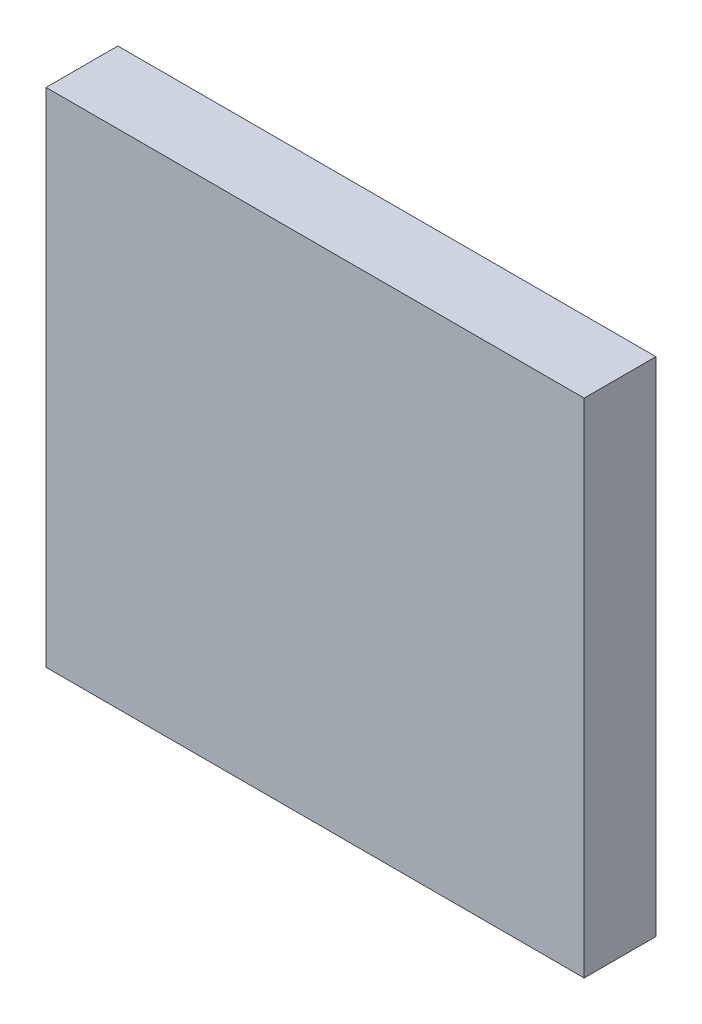
ISO-10303-21;
HEADER;
FILE_DESCRIPTION(('STEP AP214'),'2;1');
FILE_NAME('part.step','',(''),(''),'','','');
FILE_SCHEMA(('AUTOMOTIVE_DESIGN { 1 0 10303 214 1 1 1 1 }'));
ENDSEC;
DATA;
#1=APPLICATION_CONTEXT('core data for automotive mechanical design processes');
#2=APPLICATION_PROTOCOL_DEFINITION('international standard','automotive_design',2000,#1);
#3=PRODUCT_CONTEXT('',#1,'mechanical');
#4=PRODUCT('Part','Part','',(#3));
#5=PRODUCT_RELATED_PRODUCT_CATEGORY('part','',(#4));
#6=PRODUCT_DEFINITION_FORMATION('','',#4);
#7=PRODUCT_DEFINITION_CONTEXT('part definition',#1,'design');
#8=PRODUCT_DEFINITION('design','',#6,#7);
#9=PRODUCT_DEFINITION_SHAPE('','',#8);
#10=(LENGTH_UNIT() NAMED_UNIT(*) SI_UNIT(.MILLI.,.METRE.));
#11=(NAMED_UNIT(*) PLANE_ANGLE_UNIT() SI_UNIT($,.RADIAN.));
#12=(NAMED_UNIT(*) SI_UNIT($,.STERADIAN.) SOLID_ANGLE_UNIT());
#13=UNCERTAINTY_MEASURE_WITH_UNIT(LENGTH_MEASURE(1.E-05),#10,'distance_accuracy_value','');
#14=(GEOMETRIC_REPRESENTATION_CONTEXT(3) GLOBAL_UNCERTAINTY_ASSIGNED_CONTEXT((#13)) GLOBAL_UNIT_ASSIGNED_CONTEXT((#10,
#11,#12)) REPRESENTATION_CONTEXT('',''));
#15=CARTESIAN_POINT('',(0.,0.,0.));
#16=DIRECTION('',(0.,0.,1.));
#17=DIRECTION('',(1.,0.,0.));
#18=AXIS2_PLACEMENT_3D('',#15,#16,#17);
#19=CARTESIAN_POINT('',(75.,-70.,20.));
#20=DIRECTION('',(-1.,0.,0.));
#21=DIRECTION('',(0.,0.,1.));
#22=AXIS2_PLACEMENT_3D('',#19,#20,#21);
#23=PLANE('',#22);
#24=DIRECTION('',(0.,1.,0.));
#25=VECTOR('',#24,1.);
#26=CARTESIAN_POINT('',(75.,-70.,0.));
#27=LINE('',#26,#25);
#28=CARTESIAN_POINT('',(75.,-70.,0.));
#29=VERTEX_POINT('',#28);
#30=CARTESIAN_POINT('',(75.,70.,0.));
#31=VERTEX_POINT('',#30);
#32=EDGE_CURVE('E95',#29,#31,#27,.T.);
#33=ORIENTED_EDGE('',*,*,#32,.T.);
#34=DIRECTION('',(0.,0.,-1.));
#35=VECTOR('',#34,1.);
#36=CARTESIAN_POINT('',(75.,70.,20.));
#37=LINE('',#36,#35);
#38=CARTESIAN_POINT('',(75.,70.,20.));
#39=VERTEX_POINT('',#38);
#40=EDGE_CURVE('E11',#39,#31,#37,.T.);
#41=ORIENTED_EDGE('',*,*,#40,.F.);
#42=DIRECTION('',(0.,1.,0.));
#43=VECTOR('',#42,1.);
#44=CARTESIAN_POINT('',(75.,-70.,20.));
#45=LINE('',#44,#43);
#46=CARTESIAN_POINT('',(75.,-70.,20.));
#47=VERTEX_POINT('',#46);
#48=EDGE_CURVE('E83',#47,#39,#45,.T.);
#49=ORIENTED_EDGE('',*,*,#48,.F.);
#50=DIRECTION('',(0.,0.,-1.));
#51=VECTOR('',#50,1.);
#52=CARTESIAN_POINT('',(75.,-70.,20.));
#53=LINE('',#52,#51);
#54=EDGE_CURVE('E91',#47,#29,#53,.T.);
#55=ORIENTED_EDGE('',*,*,#54,.T.);
#56=EDGE_LOOP('',(#33,#41,#49,#55));
#57=FACE_BOUND('',#56,.T.);
#58=ADVANCED_FACE('F32',(#57),#23,.F.);
#59=CARTESIAN_POINT('',(-75.,70.,20.));
#60=DIRECTION('',(0.,-1.,0.));
#61=DIRECTION('',(0.,0.,-1.));
#62=AXIS2_PLACEMENT_3D('',#59,#60,#61);
#63=PLANE('',#62);
#64=DIRECTION('',(-1.,0.,0.));
#65=VECTOR('',#64,1.);
#66=CARTESIAN_POINT('',(-75.,70.,0.));
#67=LINE('',#66,#65);
#68=CARTESIAN_POINT('',(-75.,70.,0.));
#69=VERTEX_POINT('',#68);
#70=EDGE_CURVE('E87',#31,#69,#67,.T.);
#71=ORIENTED_EDGE('',*,*,#70,.T.);
#72=DIRECTION('',(0.,0.,-1.));
#73=VECTOR('',#72,1.);
#74=CARTESIAN_POINT('',(-75.,70.,20.));
#75=LINE('',#74,#73);
#76=CARTESIAN_POINT('',(-75.,70.,20.));
#77=VERTEX_POINT('',#76);
#78=EDGE_CURVE('E40',#77,#69,#75,.T.);
#79=ORIENTED_EDGE('',*,*,#78,.F.);
#80=DIRECTION('',(-1.,0.,0.));
#81=VECTOR('',#80,1.);
#82=CARTESIAN_POINT('',(-75.,70.,20.));
#83=LINE('',#82,#81);
#84=EDGE_CURVE('E78',#39,#77,#83,.T.);
#85=ORIENTED_EDGE('',*,*,#84,.F.);
#86=ORIENTED_EDGE('',*,*,#40,.T.);
#87=EDGE_LOOP('',(#71,#79,#85,#86));
#88=FACE_BOUND('',#87,.T.);
#89=ADVANCED_FACE('F86',(#88),#63,.F.);
#90=CARTESIAN_POINT('',(-75.,-70.,20.));
#91=DIRECTION('',(1.,0.,0.));
#92=DIRECTION('',(0.,0.,-1.));
#93=AXIS2_PLACEMENT_3D('',#90,#91,#92);
#94=PLANE('',#93);
#95=DIRECTION('',(0.,-1.,0.));
#96=VECTOR('',#95,1.);
#97=CARTESIAN_POINT('',(-75.,-70.,0.));
#98=LINE('',#97,#96);
#99=CARTESIAN_POINT('',(-75.,-70.,0.));
#100=VERTEX_POINT('',#99);
#101=EDGE_CURVE('E65',#69,#100,#98,.T.);
#102=ORIENTED_EDGE('',*,*,#101,.T.);
#103=DIRECTION('',(0.,0.,-1.));
#104=VECTOR('',#103,1.);
#105=CARTESIAN_POINT('',(-75.,-70.,20.));
#106=LINE('',#105,#104);
#107=CARTESIAN_POINT('',(-75.,-70.,20.));
#108=VERTEX_POINT('',#107);
#109=EDGE_CURVE('E88',#108,#100,#106,.T.);
#110=ORIENTED_EDGE('',*,*,#109,.F.);
#111=DIRECTION('',(0.,-1.,0.));
#112=VECTOR('',#111,1.);
#113=CARTESIAN_POINT('',(-75.,-70.,20.));
#114=LINE('',#113,#112);
#115=EDGE_CURVE('E81',#77,#108,#114,.T.);
#116=ORIENTED_EDGE('',*,*,#115,.F.);
#117=ORIENTED_EDGE('',*,*,#78,.T.);
#118=EDGE_LOOP('',(#102,#110,#116,#117));
#119=FACE_BOUND('',#118,.T.);
#120=ADVANCED_FACE('F89',(#119),#94,.F.);
#121=CARTESIAN_POINT('',(-75.,-70.,20.));
#122=DIRECTION('',(0.,1.,0.));
#123=DIRECTION('',(0.,0.,1.));
#124=AXIS2_PLACEMENT_3D('',#121,#122,#123);
#125=PLANE('',#124);
#126=DIRECTION('',(1.,0.,0.));
#127=VECTOR('',#126,1.);
#128=CARTESIAN_POINT('',(-75.,-70.,0.));
#129=LINE('',#128,#127);
#130=EDGE_CURVE('E71',#100,#29,#129,.T.);
#131=ORIENTED_EDGE('',*,*,#130,.T.);
#132=ORIENTED_EDGE('',*,*,#54,.F.);
#133=DIRECTION('',(1.,0.,0.));
#134=VECTOR('',#133,1.);
#135=CARTESIAN_POINT('',(-75.,-70.,20.));
#136=LINE('',#135,#134);
#137=EDGE_CURVE('E48',#108,#47,#136,.T.);
#138=ORIENTED_EDGE('',*,*,#137,.F.);
#139=ORIENTED_EDGE('',*,*,#109,.T.);
#140=EDGE_LOOP('',(#131,#132,#138,#139));
#141=FACE_BOUND('',#140,.T.);
#142=ADVANCED_FACE('F102',(#141),#125,.F.);
#143=CARTESIAN_POINT('',(0.,0.,20.));
#144=DIRECTION('',(0.,0.,-1.));
#145=DIRECTION('',(-1.,0.,0.));
#146=AXIS2_PLACEMENT_3D('',#143,#144,#145);
#147=PLANE('',#146);
#148=ORIENTED_EDGE('',*,*,#48,.T.);
#149=ORIENTED_EDGE('',*,*,#84,.T.);
#150=ORIENTED_EDGE('',*,*,#115,.T.);
#151=ORIENTED_EDGE('',*,*,#137,.T.);
#152=EDGE_LOOP('',(#148,#149,#150,#151));
#153=FACE_BOUND('',#152,.T.);
#154=ADVANCED_FACE('F79',(#153),#147,.F.);
#155=CARTESIAN_POINT('',(0.,0.,0.));
#156=DIRECTION('',(0.,0.,-1.));
#157=DIRECTION('',(-1.,0.,0.));
#158=AXIS2_PLACEMENT_3D('',#155,#156,#157);
#159=PLANE('',#158);
#160=ORIENTED_EDGE('',*,*,#32,.F.);
#161=ORIENTED_EDGE('',*,*,#130,.F.);
#162=ORIENTED_EDGE('',*,*,#101,.F.);
#163=ORIENTED_EDGE('',*,*,#70,.F.);
#164=EDGE_LOOP('',(#160,#161,#162,#163));
#165=FACE_BOUND('',#164,.T.);
#166=ADVANCED_FACE('F105',(#165),#159,.T.);
#167=CLOSED_SHELL('',(#58,#89,#120,#142,#154,#166));
#168=MANIFOLD_SOLID_BREP('B2',#167);
#169=ADVANCED_BREP_SHAPE_REPRESENTATION('',(#18,#168),#14);
#170=SHAPE_DEFINITION_REPRESENTATION(#9,#169);
ENDSEC;
END-ISO-10303-21;
